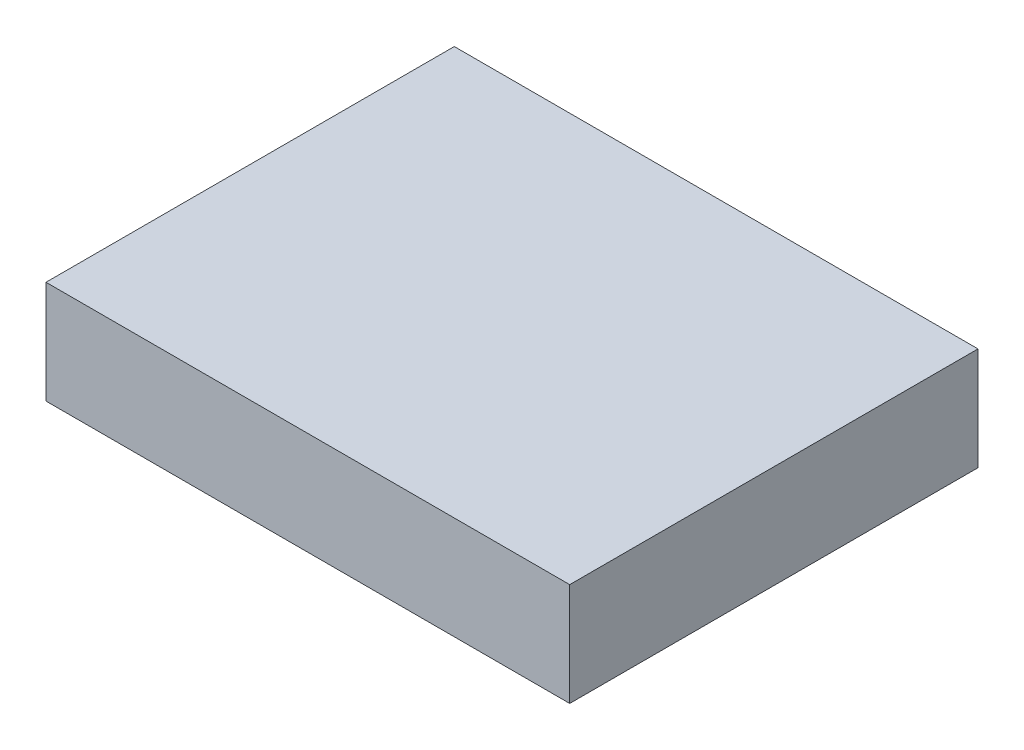
ISO-10303-21;
HEADER;
FILE_DESCRIPTION(('STEP AP214'),'2;1');
FILE_NAME('part.step','',(''),(''),'','','');
FILE_SCHEMA(('AUTOMOTIVE_DESIGN { 1 0 10303 214 1 1 1 1 }'));
ENDSEC;
DATA;
#1=APPLICATION_CONTEXT('core data for automotive mechanical design processes');
#2=APPLICATION_PROTOCOL_DEFINITION('international standard','automotive_design',2000,#1);
#3=PRODUCT_CONTEXT('',#1,'mechanical');
#4=PRODUCT('Part','Part','',(#3));
#5=PRODUCT_RELATED_PRODUCT_CATEGORY('part','',(#4));
#6=PRODUCT_DEFINITION_FORMATION('','',#4);
#7=PRODUCT_DEFINITION_CONTEXT('part definition',#1,'design');
#8=PRODUCT_DEFINITION('design','',#6,#7);
#9=PRODUCT_DEFINITION_SHAPE('','',#8);
#10=(LENGTH_UNIT() NAMED_UNIT(*) SI_UNIT(.MILLI.,.METRE.));
#11=(NAMED_UNIT(*) PLANE_ANGLE_UNIT() SI_UNIT($,.RADIAN.));
#12=(NAMED_UNIT(*) SI_UNIT($,.STERADIAN.) SOLID_ANGLE_UNIT());
#13=UNCERTAINTY_MEASURE_WITH_UNIT(LENGTH_MEASURE(1.E-05),#10,'distance_accuracy_value','');
#14=(GEOMETRIC_REPRESENTATION_CONTEXT(3) GLOBAL_UNCERTAINTY_ASSIGNED_CONTEXT((#13)) GLOBAL_UNIT_ASSIGNED_CONTEXT((#10,
#11,#12)) REPRESENTATION_CONTEXT('',''));
#15=CARTESIAN_POINT('',(0.,0.,0.));
#16=DIRECTION('',(0.,0.,1.));
#17=DIRECTION('',(1.,0.,0.));
#18=AXIS2_PLACEMENT_3D('',#15,#16,#17);
#19=CARTESIAN_POINT('',(25.4422511771734,10.,19.8349129243095));
#20=DIRECTION('',(-1.,0.,0.));
#21=DIRECTION('',(0.,0.,1.));
#22=AXIS2_PLACEMENT_3D('',#19,#20,#21);
#23=PLANE('',#22);
#24=DIRECTION('',(0.,0.,-1.));
#25=VECTOR('',#24,1.);
#26=CARTESIAN_POINT('',(25.4422511771734,0.,19.8349129243095));
#27=LINE('',#26,#25);
#28=CARTESIAN_POINT('',(25.4422511771734,0.,19.8349129243095));
#29=VERTEX_POINT('',#28);
#30=CARTESIAN_POINT('',(25.4422511771734,0.,-19.8349129243095));
#31=VERTEX_POINT('',#30);
#32=EDGE_CURVE('E102',#29,#31,#27,.T.);
#33=ORIENTED_EDGE('',*,*,#32,.T.);
#34=DIRECTION('',(0.,-1.,0.));
#35=VECTOR('',#34,1.);
#36=CARTESIAN_POINT('',(25.4422511771734,10.,-19.8349129243095));
#37=LINE('',#36,#35);
#38=CARTESIAN_POINT('',(25.4422511771734,10.,-19.8349129243095));
#39=VERTEX_POINT('',#38);
#40=EDGE_CURVE('E11',#39,#31,#37,.T.);
#41=ORIENTED_EDGE('',*,*,#40,.F.);
#42=DIRECTION('',(0.,0.,-1.));
#43=VECTOR('',#42,1.);
#44=CARTESIAN_POINT('',(25.4422511771734,10.,19.8349129243095));
#45=LINE('',#44,#43);
#46=CARTESIAN_POINT('',(25.4422511771734,10.,19.8349129243095));
#47=VERTEX_POINT('',#46);
#48=EDGE_CURVE('E90',#47,#39,#45,.T.);
#49=ORIENTED_EDGE('',*,*,#48,.F.);
#50=DIRECTION('',(0.,-1.,0.));
#51=VECTOR('',#50,1.);
#52=CARTESIAN_POINT('',(25.4422511771734,10.,19.8349129243095));
#53=LINE('',#52,#51);
#54=EDGE_CURVE('E98',#47,#29,#53,.T.);
#55=ORIENTED_EDGE('',*,*,#54,.T.);
#56=EDGE_LOOP('',(#33,#41,#49,#55));
#57=FACE_BOUND('',#56,.T.);
#58=ADVANCED_FACE('F39',(#57),#23,.F.);
#59=CARTESIAN_POINT('',(-25.4422511771734,10.,-19.8349129243095));
#60=DIRECTION('',(0.,0.,1.));
#61=DIRECTION('',(1.,0.,0.));
#62=AXIS2_PLACEMENT_3D('',#59,#60,#61);
#63=PLANE('',#62);
#64=DIRECTION('',(-1.,0.,0.));
#65=VECTOR('',#64,1.);
#66=CARTESIAN_POINT('',(-25.4422511771734,0.,-19.8349129243095));
#67=LINE('',#66,#65);
#68=CARTESIAN_POINT('',(-25.4422511771734,0.,-19.8349129243095));
#69=VERTEX_POINT('',#68);
#70=EDGE_CURVE('E94',#31,#69,#67,.T.);
#71=ORIENTED_EDGE('',*,*,#70,.T.);
#72=DIRECTION('',(0.,-1.,0.));
#73=VECTOR('',#72,1.);
#74=CARTESIAN_POINT('',(-25.4422511771734,10.,-19.8349129243095));
#75=LINE('',#74,#73);
#76=CARTESIAN_POINT('',(-25.4422511771734,10.,-19.8349129243095));
#77=VERTEX_POINT('',#76);
#78=EDGE_CURVE('E47',#77,#69,#75,.T.);
#79=ORIENTED_EDGE('',*,*,#78,.F.);
#80=DIRECTION('',(-1.,0.,0.));
#81=VECTOR('',#80,1.);
#82=CARTESIAN_POINT('',(-25.4422511771734,10.,-19.8349129243095));
#83=LINE('',#82,#81);
#84=EDGE_CURVE('E85',#39,#77,#83,.T.);
#85=ORIENTED_EDGE('',*,*,#84,.F.);
#86=ORIENTED_EDGE('',*,*,#40,.T.);
#87=EDGE_LOOP('',(#71,#79,#85,#86));
#88=FACE_BOUND('',#87,.T.);
#89=ADVANCED_FACE('F93',(#88),#63,.F.);
#90=CARTESIAN_POINT('',(-25.4422511771734,10.,19.8349129243095));
#91=DIRECTION('',(1.,0.,0.));
#92=DIRECTION('',(0.,0.,-1.));
#93=AXIS2_PLACEMENT_3D('',#90,#91,#92);
#94=PLANE('',#93);
#95=DIRECTION('',(0.,0.,1.));
#96=VECTOR('',#95,1.);
#97=CARTESIAN_POINT('',(-25.4422511771734,0.,19.8349129243095));
#98=LINE('',#97,#96);
#99=CARTESIAN_POINT('',(-25.4422511771734,0.,19.8349129243095));
#100=VERTEX_POINT('',#99);
#101=EDGE_CURVE('E72',#69,#100,#98,.T.);
#102=ORIENTED_EDGE('',*,*,#101,.T.);
#103=DIRECTION('',(0.,-1.,0.));
#104=VECTOR('',#103,1.);
#105=CARTESIAN_POINT('',(-25.4422511771734,10.,19.8349129243095));
#106=LINE('',#105,#104);
#107=CARTESIAN_POINT('',(-25.4422511771734,10.,19.8349129243095));
#108=VERTEX_POINT('',#107);
#109=EDGE_CURVE('E95',#108,#100,#106,.T.);
#110=ORIENTED_EDGE('',*,*,#109,.F.);
#111=DIRECTION('',(0.,0.,1.));
#112=VECTOR('',#111,1.);
#113=CARTESIAN_POINT('',(-25.4422511771734,10.,19.8349129243095));
#114=LINE('',#113,#112);
#115=EDGE_CURVE('E88',#77,#108,#114,.T.);
#116=ORIENTED_EDGE('',*,*,#115,.F.);
#117=ORIENTED_EDGE('',*,*,#78,.T.);
#118=EDGE_LOOP('',(#102,#110,#116,#117));
#119=FACE_BOUND('',#118,.T.);
#120=ADVANCED_FACE('F96',(#119),#94,.F.);
#121=CARTESIAN_POINT('',(-25.4422511771734,10.,19.8349129243095));
#122=DIRECTION('',(0.,0.,-1.));
#123=DIRECTION('',(-1.,0.,0.));
#124=AXIS2_PLACEMENT_3D('',#121,#122,#123);
#125=PLANE('',#124);
#126=DIRECTION('',(1.,0.,0.));
#127=VECTOR('',#126,1.);
#128=CARTESIAN_POINT('',(-25.4422511771734,0.,19.8349129243095));
#129=LINE('',#128,#127);
#130=EDGE_CURVE('E78',#100,#29,#129,.T.);
#131=ORIENTED_EDGE('',*,*,#130,.T.);
#132=ORIENTED_EDGE('',*,*,#54,.F.);
#133=DIRECTION('',(1.,0.,0.));
#134=VECTOR('',#133,1.);
#135=CARTESIAN_POINT('',(-25.4422511771734,10.,19.8349129243095));
#136=LINE('',#135,#134);
#137=EDGE_CURVE('E55',#108,#47,#136,.T.);
#138=ORIENTED_EDGE('',*,*,#137,.F.);
#139=ORIENTED_EDGE('',*,*,#109,.T.);
#140=EDGE_LOOP('',(#131,#132,#138,#139));
#141=FACE_BOUND('',#140,.T.);
#142=ADVANCED_FACE('F109',(#141),#125,.F.);
#143=CARTESIAN_POINT('',(0.,10.,0.));
#144=DIRECTION('',(0.,-1.,0.));
#145=DIRECTION('',(0.,0.,-1.));
#146=AXIS2_PLACEMENT_3D('',#143,#144,#145);
#147=PLANE('',#146);
#148=ORIENTED_EDGE('',*,*,#48,.T.);
#149=ORIENTED_EDGE('',*,*,#84,.T.);
#150=ORIENTED_EDGE('',*,*,#115,.T.);
#151=ORIENTED_EDGE('',*,*,#137,.T.);
#152=EDGE_LOOP('',(#148,#149,#150,#151));
#153=FACE_BOUND('',#152,.T.);
#154=ADVANCED_FACE('F86',(#153),#147,.F.);
#155=CARTESIAN_POINT('',(0.,0.,0.));
#156=DIRECTION('',(0.,-1.,0.));
#157=DIRECTION('',(0.,0.,-1.));
#158=AXIS2_PLACEMENT_3D('',#155,#156,#157);
#159=PLANE('',#158);
#160=ORIENTED_EDGE('',*,*,#32,.F.);
#161=ORIENTED_EDGE('',*,*,#130,.F.);
#162=ORIENTED_EDGE('',*,*,#101,.F.);
#163=ORIENTED_EDGE('',*,*,#70,.F.);
#164=EDGE_LOOP('',(#160,#161,#162,#163));
#165=FACE_BOUND('',#164,.T.);
#166=ADVANCED_FACE('F112',(#165),#159,.T.);
#167=CLOSED_SHELL('',(#58,#89,#120,#142,#154,#166));
#168=MANIFOLD_SOLID_BREP('B2',#167);
#169=ADVANCED_BREP_SHAPE_REPRESENTATION('',(#18,#168),#14);
#170=SHAPE_DEFINITION_REPRESENTATION(#9,#169);
ENDSEC;
END-ISO-10303-21;
